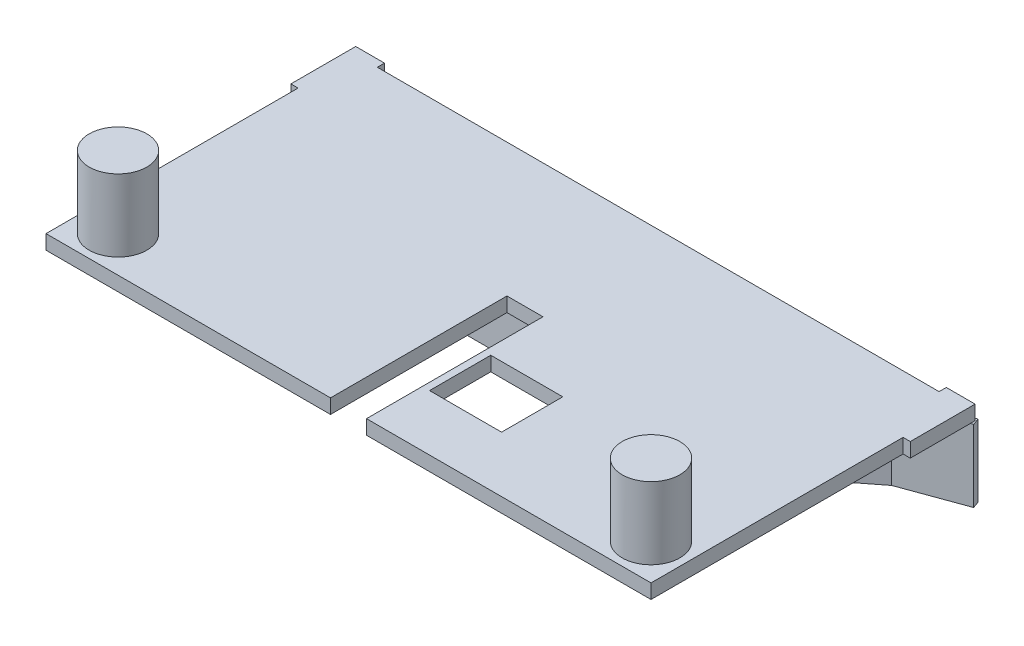
ISO-10303-21;
HEADER;
FILE_DESCRIPTION(('STEP AP214'),'2;1');
FILE_NAME('part.step','',(''),(''),'','','');
FILE_SCHEMA(('AUTOMOTIVE_DESIGN { 1 0 10303 214 1 1 1 1 }'));
ENDSEC;
DATA;
#1=APPLICATION_CONTEXT('core data for automotive mechanical design processes');
#2=APPLICATION_PROTOCOL_DEFINITION('international standard','automotive_design',2000,#1);
#3=PRODUCT_CONTEXT('',#1,'mechanical');
#4=PRODUCT('Part','Part','',(#3));
#5=PRODUCT_RELATED_PRODUCT_CATEGORY('part','',(#4));
#6=PRODUCT_DEFINITION_FORMATION('','',#4);
#7=PRODUCT_DEFINITION_CONTEXT('part definition',#1,'design');
#8=PRODUCT_DEFINITION('design','',#6,#7);
#9=PRODUCT_DEFINITION_SHAPE('','',#8);
#10=(LENGTH_UNIT() NAMED_UNIT(*) SI_UNIT(.MILLI.,.METRE.));
#11=(NAMED_UNIT(*) PLANE_ANGLE_UNIT() SI_UNIT($,.RADIAN.));
#12=(NAMED_UNIT(*) SI_UNIT($,.STERADIAN.) SOLID_ANGLE_UNIT());
#13=UNCERTAINTY_MEASURE_WITH_UNIT(LENGTH_MEASURE(1.E-05),#10,'distance_accuracy_value','');
#14=(GEOMETRIC_REPRESENTATION_CONTEXT(3) GLOBAL_UNCERTAINTY_ASSIGNED_CONTEXT((#13)) GLOBAL_UNIT_ASSIGNED_CONTEXT((#10,
#11,#12)) REPRESENTATION_CONTEXT('',''));
#15=CARTESIAN_POINT('',(0.,0.,0.));
#16=DIRECTION('',(0.,0.,1.));
#17=DIRECTION('',(1.,0.,0.));
#18=AXIS2_PLACEMENT_3D('',#15,#16,#17);
#19=CARTESIAN_POINT('',(0.,-6.35,0.));
#20=DIRECTION('',(0.,-1.,0.));
#21=DIRECTION('',(0.,0.,-1.));
#22=AXIS2_PLACEMENT_3D('',#19,#20,#21);
#23=PLANE('',#22);
#24=DIRECTION('',(0.93969262078591,0.,-0.342020143325663));
#25=VECTOR('',#24,1.);
#26=CARTESIAN_POINT('',(273.05,-6.35,-142.24));
#27=LINE('',#26,#25);
#28=CARTESIAN_POINT('',(219.136547038803,-6.35,-122.617107895613));
#29=VERTEX_POINT('',#28);
#30=CARTESIAN_POINT('',(266.071407354586,-6.35,-139.7));
#31=VERTEX_POINT('',#30);
#32=EDGE_CURVE('E50',#29,#31,#27,.T.);
#33=ORIENTED_EDGE('',*,*,#32,.F.);
#34=DIRECTION('',(0.788707331575262,0.,-0.614768855033686));
#35=VECTOR('',#34,1.);
#36=CARTESIAN_POINT('',(127.,-6.35,-50.8));
#37=LINE('',#36,#35);
#38=CARTESIAN_POINT('',(127.,-6.35,-50.8));
#39=VERTEX_POINT('',#38);
#40=EDGE_CURVE('E54',#39,#29,#37,.T.);
#41=ORIENTED_EDGE('',*,*,#40,.F.);
#42=DIRECTION('',(1.,0.,0.));
#43=VECTOR('',#42,1.);
#44=CARTESIAN_POINT('',(-127.,-6.35,-50.8));
#45=LINE('',#44,#43);
#46=CARTESIAN_POINT('',(-127.,-6.35,-50.8));
#47=VERTEX_POINT('',#46);
#48=EDGE_CURVE('E460',#47,#39,#45,.T.);
#49=ORIENTED_EDGE('',*,*,#48,.F.);
#50=DIRECTION('',(0.788707331575262,0.,0.614768855033686));
#51=VECTOR('',#50,1.);
#52=CARTESIAN_POINT('',(-219.136547038803,-6.35,-122.617107895613));
#53=LINE('',#52,#51);
#54=CARTESIAN_POINT('',(-219.136547038803,-6.35,-122.617107895613));
#55=VERTEX_POINT('',#54);
#56=EDGE_CURVE('E455',#55,#47,#53,.T.);
#57=ORIENTED_EDGE('',*,*,#56,.F.);
#58=DIRECTION('',(0.93969262078591,0.,0.342020143325663));
#59=VECTOR('',#58,1.);
#60=CARTESIAN_POINT('',(-273.05,-6.35,-142.24));
#61=LINE('',#60,#59);
#62=CARTESIAN_POINT('',(-266.071407354585,-6.35,-139.7));
#63=VERTEX_POINT('',#62);
#64=EDGE_CURVE('E441',#63,#55,#61,.T.);
#65=ORIENTED_EDGE('',*,*,#64,.F.);
#66=DIRECTION('',(-1.,0.,0.));
#67=VECTOR('',#66,1.);
#68=CARTESIAN_POINT('',(-273.05,-6.35,-139.7));
#69=LINE('',#68,#67);
#70=CARTESIAN_POINT('',(-247.649999999999,-6.35,-139.7));
#71=VERTEX_POINT('',#70);
#72=EDGE_CURVE('E430',#71,#63,#69,.T.);
#73=ORIENTED_EDGE('',*,*,#72,.F.);
#74=DIRECTION('',(0.,0.,1.));
#75=VECTOR('',#74,1.);
#76=CARTESIAN_POINT('',(-247.649999999999,-6.35,-133.35));
#77=LINE('',#76,#75);
#78=CARTESIAN_POINT('',(-247.649999999999,-6.35,-133.35));
#79=VERTEX_POINT('',#78);
#80=EDGE_CURVE('E292',#71,#79,#77,.T.);
#81=ORIENTED_EDGE('',*,*,#80,.T.);
#82=DIRECTION('',(1.,0.,0.));
#83=VECTOR('',#82,1.);
#84=CARTESIAN_POINT('',(-247.649999999999,-6.35,-133.35));
#85=LINE('',#84,#83);
#86=CARTESIAN_POINT('',(247.650000000001,-6.35,-133.35));
#87=VERTEX_POINT('',#86);
#88=EDGE_CURVE('E296',#79,#87,#85,.T.);
#89=ORIENTED_EDGE('',*,*,#88,.T.);
#90=DIRECTION('',(0.,0.,-1.));
#91=VECTOR('',#90,1.);
#92=CARTESIAN_POINT('',(247.650000000001,-6.35,-133.35));
#93=LINE('',#92,#91);
#94=CARTESIAN_POINT('',(247.650000000001,-6.35,-139.7));
#95=VERTEX_POINT('',#94);
#96=EDGE_CURVE('E289',#87,#95,#93,.T.);
#97=ORIENTED_EDGE('',*,*,#96,.T.);
#98=EDGE_CURVE('E429',#31,#95,#69,.T.);
#99=ORIENTED_EDGE('',*,*,#98,.F.);
#100=EDGE_LOOP('',(#33,#41,#49,#57,#65,#73,#81,#89,#97,#99));
#101=FACE_BOUND('',#100,.T.);
#102=ADVANCED_FACE('F35',(#101),#23,.T.);
#103=CARTESIAN_POINT('',(-273.05,6.35,-139.7));
#104=DIRECTION('',(0.,0.,1.));
#105=DIRECTION('',(1.,0.,0.));
#106=AXIS2_PLACEMENT_3D('',#103,#104,#105);
#107=PLANE('',#106);
#108=CARTESIAN_POINT('',(273.05,-6.35,-139.7));
#109=VERTEX_POINT('',#108);
#110=EDGE_CURVE('E425',#109,#31,#69,.T.);
#111=ORIENTED_EDGE('',*,*,#110,.T.);
#112=ORIENTED_EDGE('',*,*,#98,.T.);
#113=DIRECTION('',(0.,1.,0.));
#114=VECTOR('',#113,1.);
#115=CARTESIAN_POINT('',(247.650000000001,-6.35,-139.7));
#116=LINE('',#115,#114);
#117=CARTESIAN_POINT('',(247.650000000001,6.35,-139.7));
#118=VERTEX_POINT('',#117);
#119=EDGE_CURVE('E299',#95,#118,#116,.T.);
#120=ORIENTED_EDGE('',*,*,#119,.T.);
#121=DIRECTION('',(-1.,0.,0.));
#122=VECTOR('',#121,1.);
#123=CARTESIAN_POINT('',(-273.05,6.35,-139.7));
#124=LINE('',#123,#122);
#125=CARTESIAN_POINT('',(273.05,6.35,-139.7));
#126=VERTEX_POINT('',#125);
#127=EDGE_CURVE('E411',#126,#118,#124,.T.);
#128=ORIENTED_EDGE('',*,*,#127,.F.);
#129=DIRECTION('',(0.,-1.,0.));
#130=VECTOR('',#129,1.);
#131=CARTESIAN_POINT('',(273.05,6.35,-139.7));
#132=LINE('',#131,#130);
#133=EDGE_CURVE('E438',#126,#109,#132,.T.);
#134=ORIENTED_EDGE('',*,*,#133,.T.);
#135=EDGE_LOOP('',(#111,#112,#120,#128,#134));
#136=FACE_BOUND('',#135,.T.);
#137=ADVANCED_FACE('F551',(#136),#107,.F.);
#138=CARTESIAN_POINT('',(-273.05,6.35,139.7));
#139=DIRECTION('',(0.,0.,-1.));
#140=DIRECTION('',(-1.,0.,0.));
#141=AXIS2_PLACEMENT_3D('',#138,#139,#140);
#142=PLANE('',#141);
#143=DIRECTION('',(1.,0.,0.));
#144=VECTOR('',#143,1.);
#145=CARTESIAN_POINT('',(-273.05,-6.35,139.7));
#146=LINE('',#145,#144);
#147=CARTESIAN_POINT('',(15.875,-6.35,139.7));
#148=VERTEX_POINT('',#147);
#149=CARTESIAN_POINT('',(266.7,-6.35,139.7));
#150=VERTEX_POINT('',#149);
#151=EDGE_CURVE('E434',#148,#150,#146,.T.);
#152=ORIENTED_EDGE('',*,*,#151,.T.);
#153=DIRECTION('',(0.,1.,0.));
#154=VECTOR('',#153,1.);
#155=CARTESIAN_POINT('',(266.7,-6.35,139.7));
#156=LINE('',#155,#154);
#157=CARTESIAN_POINT('',(266.7,6.35,139.7));
#158=VERTEX_POINT('',#157);
#159=EDGE_CURVE('E303',#150,#158,#156,.T.);
#160=ORIENTED_EDGE('',*,*,#159,.T.);
#161=DIRECTION('',(1.,0.,0.));
#162=VECTOR('',#161,1.);
#163=CARTESIAN_POINT('',(-273.05,6.35,139.7));
#164=LINE('',#163,#162);
#165=CARTESIAN_POINT('',(15.875,6.35,139.7));
#166=VERTEX_POINT('',#165);
#167=EDGE_CURVE('E417',#166,#158,#164,.T.);
#168=ORIENTED_EDGE('',*,*,#167,.F.);
#169=DIRECTION('',(0.,1.,0.));
#170=VECTOR('',#169,1.);
#171=CARTESIAN_POINT('',(15.875,-6.35,139.7));
#172=LINE('',#171,#170);
#173=EDGE_CURVE('E398',#148,#166,#172,.T.);
#174=ORIENTED_EDGE('',*,*,#173,.F.);
#175=EDGE_LOOP('',(#152,#160,#168,#174));
#176=FACE_BOUND('',#175,.T.);
#177=ADVANCED_FACE('F533',(#176),#142,.F.);
#178=CARTESIAN_POINT('',(273.05,6.35,139.7));
#179=DIRECTION('',(-1.,0.,0.));
#180=DIRECTION('',(0.,0.,1.));
#181=AXIS2_PLACEMENT_3D('',#178,#179,#180);
#182=PLANE('',#181);
#183=DIRECTION('',(0.,0.,-1.));
#184=VECTOR('',#183,1.);
#185=CARTESIAN_POINT('',(273.05,6.35,139.7));
#186=LINE('',#185,#184);
#187=CARTESIAN_POINT('',(273.05,6.35,-82.55));
#188=VERTEX_POINT('',#187);
#189=EDGE_CURVE('E407',#188,#126,#186,.T.);
#190=ORIENTED_EDGE('',*,*,#189,.F.);
#191=DIRECTION('',(0.,1.,0.));
#192=VECTOR('',#191,1.);
#193=CARTESIAN_POINT('',(273.05,-6.35,-82.55));
#194=LINE('',#193,#192);
#195=CARTESIAN_POINT('',(273.05,-6.35,-82.55));
#196=VERTEX_POINT('',#195);
#197=EDGE_CURVE('E322',#196,#188,#194,.T.);
#198=ORIENTED_EDGE('',*,*,#197,.F.);
#199=DIRECTION('',(0.,0.,-1.));
#200=VECTOR('',#199,1.);
#201=CARTESIAN_POINT('',(273.05,-6.35,139.7));
#202=LINE('',#201,#200);
#203=CARTESIAN_POINT('',(273.05,-6.35,-135.482471144778));
#204=VERTEX_POINT('',#203);
#205=EDGE_CURVE('E421',#196,#204,#202,.T.);
#206=ORIENTED_EDGE('',*,*,#205,.T.);
#207=EDGE_CURVE('E400',#204,#109,#202,.T.);
#208=ORIENTED_EDGE('',*,*,#207,.T.);
#209=ORIENTED_EDGE('',*,*,#133,.F.);
#210=EDGE_LOOP('',(#190,#198,#206,#208,#209));
#211=FACE_BOUND('',#210,.T.);
#212=ADVANCED_FACE('F37',(#211),#182,.F.);
#213=CARTESIAN_POINT('',(-247.649999999999,6.35,-139.7));
#214=VERTEX_POINT('',#213);
#215=CARTESIAN_POINT('',(-273.05,6.35,-139.7));
#216=VERTEX_POINT('',#215);
#217=EDGE_CURVE('E409',#214,#216,#124,.T.);
#218=ORIENTED_EDGE('',*,*,#217,.F.);
#219=DIRECTION('',(0.,1.,0.));
#220=VECTOR('',#219,1.);
#221=CARTESIAN_POINT('',(-247.649999999999,-6.35,-139.7));
#222=LINE('',#221,#220);
#223=EDGE_CURVE('E313',#71,#214,#222,.T.);
#224=ORIENTED_EDGE('',*,*,#223,.F.);
#225=ORIENTED_EDGE('',*,*,#72,.T.);
#226=CARTESIAN_POINT('',(-273.05,-6.35,-139.7));
#227=VERTEX_POINT('',#226);
#228=EDGE_CURVE('E424',#63,#227,#69,.T.);
#229=ORIENTED_EDGE('',*,*,#228,.T.);
#230=DIRECTION('',(0.,-1.,0.));
#231=VECTOR('',#230,1.);
#232=CARTESIAN_POINT('',(-273.05,6.35,-139.7));
#233=LINE('',#232,#231);
#234=EDGE_CURVE('E420',#216,#227,#233,.T.);
#235=ORIENTED_EDGE('',*,*,#234,.F.);
#236=EDGE_LOOP('',(#218,#224,#225,#229,#235));
#237=FACE_BOUND('',#236,.T.);
#238=ADVANCED_FACE('F569',(#237),#107,.F.);
#239=CARTESIAN_POINT('',(-273.05,6.35,139.7));
#240=DIRECTION('',(1.,0.,0.));
#241=DIRECTION('',(0.,0.,-1.));
#242=AXIS2_PLACEMENT_3D('',#239,#240,#241);
#243=PLANE('',#242);
#244=DIRECTION('',(0.,0.,1.));
#245=VECTOR('',#244,1.);
#246=CARTESIAN_POINT('',(-273.05,-6.35,139.7));
#247=LINE('',#246,#245);
#248=CARTESIAN_POINT('',(-273.05,-6.35,-135.482471144778));
#249=VERTEX_POINT('',#248);
#250=EDGE_CURVE('E431',#227,#249,#247,.T.);
#251=ORIENTED_EDGE('',*,*,#250,.T.);
#252=CARTESIAN_POINT('',(-273.05,-6.35,-82.55));
#253=VERTEX_POINT('',#252);
#254=EDGE_CURVE('E428',#249,#253,#247,.T.);
#255=ORIENTED_EDGE('',*,*,#254,.T.);
#256=DIRECTION('',(0.,1.,0.));
#257=VECTOR('',#256,1.);
#258=CARTESIAN_POINT('',(-273.05,-6.35,-82.55));
#259=LINE('',#258,#257);
#260=CARTESIAN_POINT('',(-273.05,6.35,-82.55));
#261=VERTEX_POINT('',#260);
#262=EDGE_CURVE('E343',#253,#261,#259,.T.);
#263=ORIENTED_EDGE('',*,*,#262,.T.);
#264=DIRECTION('',(0.,0.,1.));
#265=VECTOR('',#264,1.);
#266=CARTESIAN_POINT('',(-273.05,6.35,139.7));
#267=LINE('',#266,#265);
#268=EDGE_CURVE('E414',#216,#261,#267,.T.);
#269=ORIENTED_EDGE('',*,*,#268,.F.);
#270=ORIENTED_EDGE('',*,*,#234,.T.);
#271=EDGE_LOOP('',(#251,#255,#263,#269,#270));
#272=FACE_BOUND('',#271,.T.);
#273=ADVANCED_FACE('F575',(#272),#243,.F.);
#274=CARTESIAN_POINT('',(-266.7,6.35,139.7));
#275=VERTEX_POINT('',#274);
#276=CARTESIAN_POINT('',(-15.875,6.35,139.7));
#277=VERTEX_POINT('',#276);
#278=EDGE_CURVE('E418',#275,#277,#164,.T.);
#279=ORIENTED_EDGE('',*,*,#278,.F.);
#280=DIRECTION('',(0.,1.,0.));
#281=VECTOR('',#280,1.);
#282=CARTESIAN_POINT('',(-266.7,-6.35,139.7));
#283=LINE('',#282,#281);
#284=CARTESIAN_POINT('',(-266.7,-6.35,139.7));
#285=VERTEX_POINT('',#284);
#286=EDGE_CURVE('E337',#285,#275,#283,.T.);
#287=ORIENTED_EDGE('',*,*,#286,.F.);
#288=CARTESIAN_POINT('',(-15.875,-6.35,139.7));
#289=VERTEX_POINT('',#288);
#290=EDGE_CURVE('E410',#285,#289,#146,.T.);
#291=ORIENTED_EDGE('',*,*,#290,.T.);
#292=DIRECTION('',(0.,1.,0.));
#293=VECTOR('',#292,1.);
#294=CARTESIAN_POINT('',(-15.875,-6.35,139.7));
#295=LINE('',#294,#293);
#296=EDGE_CURVE('E401',#289,#277,#295,.T.);
#297=ORIENTED_EDGE('',*,*,#296,.T.);
#298=EDGE_LOOP('',(#279,#287,#291,#297));
#299=FACE_BOUND('',#298,.T.);
#300=ADVANCED_FACE('F517',(#299),#142,.F.);
#301=CARTESIAN_POINT('',(0.,6.35,0.));
#302=DIRECTION('',(0.,-1.,0.));
#303=DIRECTION('',(0.,0.,-1.));
#304=AXIS2_PLACEMENT_3D('',#301,#302,#303);
#305=PLANE('',#304);
#306=CARTESIAN_POINT('',(-234.95,6.34999999999999,107.95));
#307=DIRECTION('',(0.,-1.,0.));
#308=DIRECTION('',(0.,0.,-1.));
#309=AXIS2_PLACEMENT_3D('',#306,#307,#308);
#310=CIRCLE('',#309,25.4);
#311=CARTESIAN_POINT('',(-234.95,6.34999999999999,82.55));
#312=VERTEX_POINT('',#311);
#313=EDGE_CURVE('E11',#312,#312,#310,.F.);
#314=ORIENTED_EDGE('',*,*,#313,.F.);
#315=EDGE_LOOP('',(#314));
#316=FACE_BOUND('',#315,.T.);
#317=CARTESIAN_POINT('',(234.95,6.34999999999999,107.95));
#318=DIRECTION('',(0.,-1.,0.));
#319=DIRECTION('',(0.,0.,-1.));
#320=AXIS2_PLACEMENT_3D('',#317,#318,#319);
#321=CIRCLE('',#320,25.4);
#322=CARTESIAN_POINT('',(234.95,6.34999999999999,82.55));
#323=VERTEX_POINT('',#322);
#324=EDGE_CURVE('E43',#323,#323,#321,.F.);
#325=ORIENTED_EDGE('',*,*,#324,.F.);
#326=EDGE_LOOP('',(#325));
#327=FACE_BOUND('',#326,.T.);
#328=DIRECTION('',(-1.,0.,0.));
#329=VECTOR('',#328,1.);
#330=CARTESIAN_POINT('',(22.225,6.35,36.5125));
#331=LINE('',#330,#329);
#332=CARTESIAN_POINT('',(85.725,6.35,36.5125));
#333=VERTEX_POINT('',#332);
#334=CARTESIAN_POINT('',(22.225,6.35,36.5125));
#335=VERTEX_POINT('',#334);
#336=EDGE_CURVE('E365',#333,#335,#331,.T.);
#337=ORIENTED_EDGE('',*,*,#336,.F.);
#338=DIRECTION('',(0.,0.,-1.));
#339=VECTOR('',#338,1.);
#340=CARTESIAN_POINT('',(85.725,6.35,90.4875));
#341=LINE('',#340,#339);
#342=CARTESIAN_POINT('',(85.725,6.35,90.4875));
#343=VERTEX_POINT('',#342);
#344=EDGE_CURVE('E310',#343,#333,#341,.T.);
#345=ORIENTED_EDGE('',*,*,#344,.F.);
#346=DIRECTION('',(1.,0.,0.));
#347=VECTOR('',#346,1.);
#348=CARTESIAN_POINT('',(22.225,6.35,90.4875));
#349=LINE('',#348,#347);
#350=CARTESIAN_POINT('',(22.225,6.35,90.4875));
#351=VERTEX_POINT('',#350);
#352=EDGE_CURVE('E354',#351,#343,#349,.T.);
#353=ORIENTED_EDGE('',*,*,#352,.F.);
#354=DIRECTION('',(0.,0.,1.));
#355=VECTOR('',#354,1.);
#356=CARTESIAN_POINT('',(22.225,6.35,90.4875));
#357=LINE('',#356,#355);
#358=EDGE_CURVE('E368',#335,#351,#357,.T.);
#359=ORIENTED_EDGE('',*,*,#358,.F.);
#360=EDGE_LOOP('',(#337,#345,#353,#359));
#361=FACE_BOUND('',#360,.T.);
#362=ORIENTED_EDGE('',*,*,#167,.T.);
#363=DIRECTION('',(0.,0.,1.));
#364=VECTOR('',#363,1.);
#365=CARTESIAN_POINT('',(266.7,6.35,139.7));
#366=LINE('',#365,#364);
#367=CARTESIAN_POINT('',(266.7,6.35,-82.55));
#368=VERTEX_POINT('',#367);
#369=EDGE_CURVE('E283',#368,#158,#366,.T.);
#370=ORIENTED_EDGE('',*,*,#369,.F.);
#371=DIRECTION('',(-1.,0.,0.));
#372=VECTOR('',#371,1.);
#373=CARTESIAN_POINT('',(266.7,6.35,-82.55));
#374=LINE('',#373,#372);
#375=EDGE_CURVE('E280',#188,#368,#374,.T.);
#376=ORIENTED_EDGE('',*,*,#375,.F.);
#377=ORIENTED_EDGE('',*,*,#189,.T.);
#378=ORIENTED_EDGE('',*,*,#127,.T.);
#379=DIRECTION('',(0.,0.,-1.));
#380=VECTOR('',#379,1.);
#381=CARTESIAN_POINT('',(247.650000000001,6.35,-133.35));
#382=LINE('',#381,#380);
#383=CARTESIAN_POINT('',(247.650000000001,6.35,-133.35));
#384=VERTEX_POINT('',#383);
#385=EDGE_CURVE('E300',#384,#118,#382,.T.);
#386=ORIENTED_EDGE('',*,*,#385,.F.);
#387=DIRECTION('',(1.,0.,0.));
#388=VECTOR('',#387,1.);
#389=CARTESIAN_POINT('',(-247.649999999999,6.35,-133.35));
#390=LINE('',#389,#388);
#391=CARTESIAN_POINT('',(-247.649999999999,6.35,-133.35));
#392=VERTEX_POINT('',#391);
#393=EDGE_CURVE('E293',#392,#384,#390,.T.);
#394=ORIENTED_EDGE('',*,*,#393,.F.);
#395=DIRECTION('',(0.,0.,1.));
#396=VECTOR('',#395,1.);
#397=CARTESIAN_POINT('',(-247.649999999999,6.35,-133.35));
#398=LINE('',#397,#396);
#399=EDGE_CURVE('E302',#214,#392,#398,.T.);
#400=ORIENTED_EDGE('',*,*,#399,.F.);
#401=ORIENTED_EDGE('',*,*,#217,.T.);
#402=ORIENTED_EDGE('',*,*,#268,.T.);
#403=DIRECTION('',(-1.,0.,0.));
#404=VECTOR('',#403,1.);
#405=CARTESIAN_POINT('',(-266.7,6.35,-82.55));
#406=LINE('',#405,#404);
#407=CARTESIAN_POINT('',(-266.7,6.35,-82.55));
#408=VERTEX_POINT('',#407);
#409=EDGE_CURVE('E334',#408,#261,#406,.T.);
#410=ORIENTED_EDGE('',*,*,#409,.F.);
#411=DIRECTION('',(0.,0.,-1.));
#412=VECTOR('',#411,1.);
#413=CARTESIAN_POINT('',(-266.7,6.35,139.7));
#414=LINE('',#413,#412);
#415=EDGE_CURVE('E338',#275,#408,#414,.T.);
#416=ORIENTED_EDGE('',*,*,#415,.F.);
#417=ORIENTED_EDGE('',*,*,#278,.T.);
#418=DIRECTION('',(0.,0.,1.));
#419=VECTOR('',#418,1.);
#420=CARTESIAN_POINT('',(-15.875,6.35,-15.875));
#421=LINE('',#420,#419);
#422=CARTESIAN_POINT('',(-15.875,6.35,-15.875));
#423=VERTEX_POINT('',#422);
#424=EDGE_CURVE('E384',#423,#277,#421,.T.);
#425=ORIENTED_EDGE('',*,*,#424,.F.);
#426=DIRECTION('',(-1.,0.,0.));
#427=VECTOR('',#426,1.);
#428=CARTESIAN_POINT('',(-15.875,6.35,-15.875));
#429=LINE('',#428,#427);
#430=CARTESIAN_POINT('',(15.875,6.35,-15.875));
#431=VERTEX_POINT('',#430);
#432=EDGE_CURVE('E393',#431,#423,#429,.T.);
#433=ORIENTED_EDGE('',*,*,#432,.F.);
#434=DIRECTION('',(0.,0.,-1.));
#435=VECTOR('',#434,1.);
#436=CARTESIAN_POINT('',(15.875,6.35,-15.875));
#437=LINE('',#436,#435);
#438=EDGE_CURVE('E346',#166,#431,#437,.T.);
#439=ORIENTED_EDGE('',*,*,#438,.F.);
#440=EDGE_LOOP('',(#362,#370,#376,#377,#378,#386,#394,#400,#401,#402,#410,#416,#417,#425,#433,#439));
#441=FACE_BOUND('',#440,.T.);
#442=ADVANCED_FACE('F513',(#316,#327,#361,#441),#305,.F.);
#443=DIRECTION('',(-0.93969262078591,0.,0.342020143325663));
#444=VECTOR('',#443,1.);
#445=CARTESIAN_POINT('',(222.25,-6.35,-116.992783244055));
#446=LINE('',#445,#444);
#447=CARTESIAN_POINT('',(222.25,-6.35,-116.992783244055));
#448=VERTEX_POINT('',#447);
#449=EDGE_CURVE('E279',#204,#448,#446,.T.);
#450=ORIENTED_EDGE('',*,*,#449,.F.);
#451=ORIENTED_EDGE('',*,*,#205,.F.);
#452=DIRECTION('',(-1.,0.,0.));
#453=VECTOR('',#452,1.);
#454=CARTESIAN_POINT('',(266.7,-6.35,-82.55));
#455=LINE('',#454,#453);
#456=CARTESIAN_POINT('',(266.7,-6.35,-82.55));
#457=VERTEX_POINT('',#456);
#458=EDGE_CURVE('E317',#196,#457,#455,.T.);
#459=ORIENTED_EDGE('',*,*,#458,.T.);
#460=DIRECTION('',(0.,0.,1.));
#461=VECTOR('',#460,1.);
#462=CARTESIAN_POINT('',(266.7,-6.35,139.7));
#463=LINE('',#462,#461);
#464=EDGE_CURVE('E320',#457,#150,#463,.T.);
#465=ORIENTED_EDGE('',*,*,#464,.T.);
#466=ORIENTED_EDGE('',*,*,#151,.F.);
#467=DIRECTION('',(0.,0.,-1.));
#468=VECTOR('',#467,1.);
#469=CARTESIAN_POINT('',(15.875,-6.35,-15.875));
#470=LINE('',#469,#468);
#471=CARTESIAN_POINT('',(15.875,-6.35,-15.875));
#472=VERTEX_POINT('',#471);
#473=EDGE_CURVE('E380',#148,#472,#470,.T.);
#474=ORIENTED_EDGE('',*,*,#473,.T.);
#475=DIRECTION('',(-1.,0.,0.));
#476=VECTOR('',#475,1.);
#477=CARTESIAN_POINT('',(-15.875,-6.35,-15.875));
#478=LINE('',#477,#476);
#479=CARTESIAN_POINT('',(-15.875,-6.35,-15.875));
#480=VERTEX_POINT('',#479);
#481=EDGE_CURVE('E383',#472,#480,#478,.T.);
#482=ORIENTED_EDGE('',*,*,#481,.T.);
#483=DIRECTION('',(0.,0.,1.));
#484=VECTOR('',#483,1.);
#485=CARTESIAN_POINT('',(-15.875,-6.35,-15.875));
#486=LINE('',#485,#484);
#487=EDGE_CURVE('E387',#480,#289,#486,.T.);
#488=ORIENTED_EDGE('',*,*,#487,.T.);
#489=ORIENTED_EDGE('',*,*,#290,.F.);
#490=DIRECTION('',(0.,0.,-1.));
#491=VECTOR('',#490,1.);
#492=CARTESIAN_POINT('',(-266.7,-6.35,139.7));
#493=LINE('',#492,#491);
#494=CARTESIAN_POINT('',(-266.7,-6.35,-82.55));
#495=VERTEX_POINT('',#494);
#496=EDGE_CURVE('E330',#285,#495,#493,.T.);
#497=ORIENTED_EDGE('',*,*,#496,.T.);
#498=DIRECTION('',(-1.,0.,0.));
#499=VECTOR('',#498,1.);
#500=CARTESIAN_POINT('',(-266.7,-6.35,-82.55));
#501=LINE('',#500,#499);
#502=EDGE_CURVE('E333',#495,#253,#501,.T.);
#503=ORIENTED_EDGE('',*,*,#502,.T.);
#504=ORIENTED_EDGE('',*,*,#254,.F.);
#505=DIRECTION('',(-0.93969262078591,0.,-0.342020143325663));
#506=VECTOR('',#505,1.);
#507=CARTESIAN_POINT('',(-222.25,-6.35,-116.992783244055));
#508=LINE('',#507,#506);
#509=CARTESIAN_POINT('',(-222.25,-6.35,-116.992783244055));
#510=VERTEX_POINT('',#509);
#511=EDGE_CURVE('E461',#510,#249,#508,.T.);
#512=ORIENTED_EDGE('',*,*,#511,.F.);
#513=DIRECTION('',(-0.788707331575263,0.,-0.614768855033685));
#514=VECTOR('',#513,1.);
#515=CARTESIAN_POINT('',(-129.182460014868,-6.35,-44.45));
#516=LINE('',#515,#514);
#517=CARTESIAN_POINT('',(-129.182460014868,-6.35,-44.45));
#518=VERTEX_POINT('',#517);
#519=EDGE_CURVE('E470',#518,#510,#516,.T.);
#520=ORIENTED_EDGE('',*,*,#519,.F.);
#521=DIRECTION('',(-1.,0.,0.));
#522=VECTOR('',#521,1.);
#523=CARTESIAN_POINT('',(129.182460014868,-6.35,-44.45));
#524=LINE('',#523,#522);
#525=CARTESIAN_POINT('',(129.182460014868,-6.35,-44.45));
#526=VERTEX_POINT('',#525);
#527=EDGE_CURVE('E473',#526,#518,#524,.T.);
#528=ORIENTED_EDGE('',*,*,#527,.F.);
#529=DIRECTION('',(-0.788707331575263,0.,0.614768855033686));
#530=VECTOR('',#529,1.);
#531=CARTESIAN_POINT('',(222.25,-6.35,-116.992783244055));
#532=LINE('',#531,#530);
#533=EDGE_CURVE('E476',#448,#526,#532,.T.);
#534=ORIENTED_EDGE('',*,*,#533,.F.);
#535=EDGE_LOOP('',(#450,#451,#459,#465,#466,#474,#482,#488,#489,#497,#503,#504,#512,#520,#528,#534));
#536=FACE_BOUND('',#535,.T.);
#537=DIRECTION('',(0.,0.,-1.));
#538=VECTOR('',#537,1.);
#539=CARTESIAN_POINT('',(85.725,-6.35,90.4875));
#540=LINE('',#539,#538);
#541=CARTESIAN_POINT('',(85.725,-6.35,90.4875));
#542=VERTEX_POINT('',#541);
#543=CARTESIAN_POINT('',(85.725,-6.35,36.5125));
#544=VERTEX_POINT('',#543);
#545=EDGE_CURVE('E350',#542,#544,#540,.T.);
#546=ORIENTED_EDGE('',*,*,#545,.T.);
#547=DIRECTION('',(-1.,0.,0.));
#548=VECTOR('',#547,1.);
#549=CARTESIAN_POINT('',(22.225,-6.35,36.5125));
#550=LINE('',#549,#548);
#551=CARTESIAN_POINT('',(22.225,-6.35,36.5125));
#552=VERTEX_POINT('',#551);
#553=EDGE_CURVE('E353',#544,#552,#550,.T.);
#554=ORIENTED_EDGE('',*,*,#553,.T.);
#555=DIRECTION('',(0.,0.,1.));
#556=VECTOR('',#555,1.);
#557=CARTESIAN_POINT('',(22.225,-6.35,90.4875));
#558=LINE('',#557,#556);
#559=CARTESIAN_POINT('',(22.225,-6.35,90.4875));
#560=VERTEX_POINT('',#559);
#561=EDGE_CURVE('E357',#552,#560,#558,.T.);
#562=ORIENTED_EDGE('',*,*,#561,.T.);
#563=DIRECTION('',(1.,0.,0.));
#564=VECTOR('',#563,1.);
#565=CARTESIAN_POINT('',(22.225,-6.35,90.4875));
#566=LINE('',#565,#564);
#567=EDGE_CURVE('E360',#560,#542,#566,.T.);
#568=ORIENTED_EDGE('',*,*,#567,.T.);
#569=EDGE_LOOP('',(#546,#554,#562,#568));
#570=FACE_BOUND('',#569,.T.);
#571=ADVANCED_FACE('F516',(#536,#570),#23,.T.);
#572=CARTESIAN_POINT('',(15.875,-6.35,-15.875));
#573=DIRECTION('',(1.,0.,0.));
#574=DIRECTION('',(0.,0.,-1.));
#575=AXIS2_PLACEMENT_3D('',#572,#573,#574);
#576=PLANE('',#575);
#577=ORIENTED_EDGE('',*,*,#438,.T.);
#578=DIRECTION('',(0.,1.,0.));
#579=VECTOR('',#578,1.);
#580=CARTESIAN_POINT('',(15.875,-6.35,-15.875));
#581=LINE('',#580,#579);
#582=EDGE_CURVE('E390',#472,#431,#581,.T.);
#583=ORIENTED_EDGE('',*,*,#582,.F.);
#584=ORIENTED_EDGE('',*,*,#473,.F.);
#585=ORIENTED_EDGE('',*,*,#173,.T.);
#586=EDGE_LOOP('',(#577,#583,#584,#585));
#587=FACE_BOUND('',#586,.T.);
#588=ADVANCED_FACE('F597',(#587),#576,.F.);
#589=CARTESIAN_POINT('',(-15.875,-6.35,-15.875));
#590=DIRECTION('',(-1.,0.,0.));
#591=DIRECTION('',(0.,0.,1.));
#592=AXIS2_PLACEMENT_3D('',#589,#590,#591);
#593=PLANE('',#592);
#594=ORIENTED_EDGE('',*,*,#424,.T.);
#595=ORIENTED_EDGE('',*,*,#296,.F.);
#596=ORIENTED_EDGE('',*,*,#487,.F.);
#597=DIRECTION('',(0.,1.,0.));
#598=VECTOR('',#597,1.);
#599=CARTESIAN_POINT('',(-15.875,-6.35,-15.875));
#600=LINE('',#599,#598);
#601=EDGE_CURVE('E404',#480,#423,#600,.T.);
#602=ORIENTED_EDGE('',*,*,#601,.T.);
#603=EDGE_LOOP('',(#594,#595,#596,#602));
#604=FACE_BOUND('',#603,.T.);
#605=ADVANCED_FACE('F592',(#604),#593,.F.);
#606=CARTESIAN_POINT('',(-15.875,-6.35,-15.875));
#607=DIRECTION('',(0.,0.,-1.));
#608=DIRECTION('',(-1.,0.,0.));
#609=AXIS2_PLACEMENT_3D('',#606,#607,#608);
#610=PLANE('',#609);
#611=ORIENTED_EDGE('',*,*,#432,.T.);
#612=ORIENTED_EDGE('',*,*,#601,.F.);
#613=ORIENTED_EDGE('',*,*,#481,.F.);
#614=ORIENTED_EDGE('',*,*,#582,.T.);
#615=EDGE_LOOP('',(#611,#612,#613,#614));
#616=FACE_BOUND('',#615,.T.);
#617=ADVANCED_FACE('F594',(#616),#610,.F.);
#618=CARTESIAN_POINT('',(-266.7,-6.35,-82.55));
#619=DIRECTION('',(0.,0.,-1.));
#620=DIRECTION('',(-1.,0.,0.));
#621=AXIS2_PLACEMENT_3D('',#618,#619,#620);
#622=PLANE('',#621);
#623=ORIENTED_EDGE('',*,*,#409,.T.);
#624=ORIENTED_EDGE('',*,*,#262,.F.);
#625=ORIENTED_EDGE('',*,*,#502,.F.);
#626=DIRECTION('',(0.,1.,0.));
#627=VECTOR('',#626,1.);
#628=CARTESIAN_POINT('',(-266.7,-6.35,-82.55));
#629=LINE('',#628,#627);
#630=EDGE_CURVE('E347',#495,#408,#629,.T.);
#631=ORIENTED_EDGE('',*,*,#630,.T.);
#632=EDGE_LOOP('',(#623,#624,#625,#631));
#633=FACE_BOUND('',#632,.T.);
#634=ADVANCED_FACE('F581',(#633),#622,.F.);
#635=CARTESIAN_POINT('',(-266.7,-6.35,139.7));
#636=DIRECTION('',(1.,0.,0.));
#637=DIRECTION('',(0.,0.,-1.));
#638=AXIS2_PLACEMENT_3D('',#635,#636,#637);
#639=PLANE('',#638);
#640=ORIENTED_EDGE('',*,*,#415,.T.);
#641=ORIENTED_EDGE('',*,*,#630,.F.);
#642=ORIENTED_EDGE('',*,*,#496,.F.);
#643=ORIENTED_EDGE('',*,*,#286,.T.);
#644=EDGE_LOOP('',(#640,#641,#642,#643));
#645=FACE_BOUND('',#644,.T.);
#646=ADVANCED_FACE('F584',(#645),#639,.F.);
#647=CARTESIAN_POINT('',(85.725,-6.35,90.4875));
#648=DIRECTION('',(1.,0.,0.));
#649=DIRECTION('',(0.,0.,-1.));
#650=AXIS2_PLACEMENT_3D('',#647,#648,#649);
#651=PLANE('',#650);
#652=ORIENTED_EDGE('',*,*,#344,.T.);
#653=DIRECTION('',(0.,1.,0.));
#654=VECTOR('',#653,1.);
#655=CARTESIAN_POINT('',(85.725,-6.35,36.5125));
#656=LINE('',#655,#654);
#657=EDGE_CURVE('E363',#544,#333,#656,.T.);
#658=ORIENTED_EDGE('',*,*,#657,.F.);
#659=ORIENTED_EDGE('',*,*,#545,.F.);
#660=DIRECTION('',(0.,1.,0.));
#661=VECTOR('',#660,1.);
#662=CARTESIAN_POINT('',(85.725,-6.35,90.4875));
#663=LINE('',#662,#661);
#664=EDGE_CURVE('E341',#542,#343,#663,.T.);
#665=ORIENTED_EDGE('',*,*,#664,.T.);
#666=EDGE_LOOP('',(#652,#658,#659,#665));
#667=FACE_BOUND('',#666,.T.);
#668=ADVANCED_FACE('F852',(#667),#651,.F.);
#669=CARTESIAN_POINT('',(22.225,-6.35,90.4875));
#670=DIRECTION('',(0.,0.,1.));
#671=DIRECTION('',(1.,0.,0.));
#672=AXIS2_PLACEMENT_3D('',#669,#670,#671);
#673=PLANE('',#672);
#674=ORIENTED_EDGE('',*,*,#352,.T.);
#675=ORIENTED_EDGE('',*,*,#664,.F.);
#676=ORIENTED_EDGE('',*,*,#567,.F.);
#677=DIRECTION('',(0.,1.,0.));
#678=VECTOR('',#677,1.);
#679=CARTESIAN_POINT('',(22.225,-6.35,90.4875));
#680=LINE('',#679,#678);
#681=EDGE_CURVE('E374',#560,#351,#680,.T.);
#682=ORIENTED_EDGE('',*,*,#681,.T.);
#683=EDGE_LOOP('',(#674,#675,#676,#682));
#684=FACE_BOUND('',#683,.T.);
#685=ADVANCED_FACE('F853',(#684),#673,.F.);
#686=CARTESIAN_POINT('',(22.225,-6.35,90.4875));
#687=DIRECTION('',(-1.,0.,0.));
#688=DIRECTION('',(0.,0.,1.));
#689=AXIS2_PLACEMENT_3D('',#686,#687,#688);
#690=PLANE('',#689);
#691=ORIENTED_EDGE('',*,*,#358,.T.);
#692=ORIENTED_EDGE('',*,*,#681,.F.);
#693=ORIENTED_EDGE('',*,*,#561,.F.);
#694=DIRECTION('',(0.,1.,0.));
#695=VECTOR('',#694,1.);
#696=CARTESIAN_POINT('',(22.225,-6.35,36.5125));
#697=LINE('',#696,#695);
#698=EDGE_CURVE('E376',#552,#335,#697,.T.);
#699=ORIENTED_EDGE('',*,*,#698,.T.);
#700=EDGE_LOOP('',(#691,#692,#693,#699));
#701=FACE_BOUND('',#700,.T.);
#702=ADVANCED_FACE('F856',(#701),#690,.F.);
#703=CARTESIAN_POINT('',(22.225,-6.35,36.5125));
#704=DIRECTION('',(0.,0.,-1.));
#705=DIRECTION('',(-1.,0.,0.));
#706=AXIS2_PLACEMENT_3D('',#703,#704,#705);
#707=PLANE('',#706);
#708=ORIENTED_EDGE('',*,*,#336,.T.);
#709=ORIENTED_EDGE('',*,*,#698,.F.);
#710=ORIENTED_EDGE('',*,*,#553,.F.);
#711=ORIENTED_EDGE('',*,*,#657,.T.);
#712=EDGE_LOOP('',(#708,#709,#710,#711));
#713=FACE_BOUND('',#712,.T.);
#714=ADVANCED_FACE('F844',(#713),#707,.F.);
#715=CARTESIAN_POINT('',(247.650000000001,-6.35,-133.35));
#716=DIRECTION('',(1.,0.,0.));
#717=DIRECTION('',(0.,0.,-1.));
#718=AXIS2_PLACEMENT_3D('',#715,#716,#717);
#719=PLANE('',#718);
#720=ORIENTED_EDGE('',*,*,#385,.T.);
#721=ORIENTED_EDGE('',*,*,#119,.F.);
#722=ORIENTED_EDGE('',*,*,#96,.F.);
#723=DIRECTION('',(0.,1.,0.));
#724=VECTOR('',#723,1.);
#725=CARTESIAN_POINT('',(247.650000000001,-6.35,-133.35));
#726=LINE('',#725,#724);
#727=EDGE_CURVE('E308',#87,#384,#726,.T.);
#728=ORIENTED_EDGE('',*,*,#727,.T.);
#729=EDGE_LOOP('',(#720,#721,#722,#728));
#730=FACE_BOUND('',#729,.T.);
#731=ADVANCED_FACE('F556',(#730),#719,.F.);
#732=CARTESIAN_POINT('',(-247.649999999999,-6.35,-133.35));
#733=DIRECTION('',(0.,0.,1.));
#734=DIRECTION('',(1.,0.,0.));
#735=AXIS2_PLACEMENT_3D('',#732,#733,#734);
#736=PLANE('',#735);
#737=ORIENTED_EDGE('',*,*,#393,.T.);
#738=ORIENTED_EDGE('',*,*,#727,.F.);
#739=ORIENTED_EDGE('',*,*,#88,.F.);
#740=DIRECTION('',(0.,1.,0.));
#741=VECTOR('',#740,1.);
#742=CARTESIAN_POINT('',(-247.649999999999,-6.35,-133.35));
#743=LINE('',#742,#741);
#744=EDGE_CURVE('E311',#79,#392,#743,.T.);
#745=ORIENTED_EDGE('',*,*,#744,.T.);
#746=EDGE_LOOP('',(#737,#738,#739,#745));
#747=FACE_BOUND('',#746,.T.);
#748=ADVANCED_FACE('F560',(#747),#736,.F.);
#749=CARTESIAN_POINT('',(-247.649999999999,-6.35,-133.35));
#750=DIRECTION('',(-1.,0.,0.));
#751=DIRECTION('',(0.,0.,1.));
#752=AXIS2_PLACEMENT_3D('',#749,#750,#751);
#753=PLANE('',#752);
#754=ORIENTED_EDGE('',*,*,#399,.T.);
#755=ORIENTED_EDGE('',*,*,#744,.F.);
#756=ORIENTED_EDGE('',*,*,#80,.F.);
#757=ORIENTED_EDGE('',*,*,#223,.T.);
#758=EDGE_LOOP('',(#754,#755,#756,#757));
#759=FACE_BOUND('',#758,.T.);
#760=ADVANCED_FACE('F562',(#759),#753,.F.);
#761=CARTESIAN_POINT('',(266.7,-6.35,139.7));
#762=DIRECTION('',(-1.,0.,0.));
#763=DIRECTION('',(0.,0.,1.));
#764=AXIS2_PLACEMENT_3D('',#761,#762,#763);
#765=PLANE('',#764);
#766=ORIENTED_EDGE('',*,*,#369,.T.);
#767=ORIENTED_EDGE('',*,*,#159,.F.);
#768=ORIENTED_EDGE('',*,*,#464,.F.);
#769=DIRECTION('',(0.,1.,0.));
#770=VECTOR('',#769,1.);
#771=CARTESIAN_POINT('',(266.7,-6.35,-82.55));
#772=LINE('',#771,#770);
#773=EDGE_CURVE('E327',#457,#368,#772,.T.);
#774=ORIENTED_EDGE('',*,*,#773,.T.);
#775=EDGE_LOOP('',(#766,#767,#768,#774));
#776=FACE_BOUND('',#775,.T.);
#777=ADVANCED_FACE('F536',(#776),#765,.F.);
#778=CARTESIAN_POINT('',(266.7,-6.35,-82.55));
#779=DIRECTION('',(0.,0.,-1.));
#780=DIRECTION('',(-1.,0.,0.));
#781=AXIS2_PLACEMENT_3D('',#778,#779,#780);
#782=PLANE('',#781);
#783=ORIENTED_EDGE('',*,*,#375,.T.);
#784=ORIENTED_EDGE('',*,*,#773,.F.);
#785=ORIENTED_EDGE('',*,*,#458,.F.);
#786=ORIENTED_EDGE('',*,*,#197,.T.);
#787=EDGE_LOOP('',(#783,#784,#785,#786));
#788=FACE_BOUND('',#787,.T.);
#789=ADVANCED_FACE('F543',(#788),#782,.F.);
#790=CARTESIAN_POINT('',(0.,-6.35,0.));
#791=DIRECTION('',(0.,1.,0.));
#792=DIRECTION('',(0.,0.,1.));
#793=AXIS2_PLACEMENT_3D('',#790,#791,#792);
#794=PLANE('',#793);
#795=ORIENTED_EDGE('',*,*,#250,.F.);
#796=ORIENTED_EDGE('',*,*,#228,.F.);
#797=CARTESIAN_POINT('',(-273.05,-6.35,-142.24));
#798=VERTEX_POINT('',#797);
#799=EDGE_CURVE('E446',#798,#63,#61,.T.);
#800=ORIENTED_EDGE('',*,*,#799,.F.);
#801=DIRECTION('',(0.342020143325662,0.,-0.939692620785911));
#802=VECTOR('',#801,1.);
#803=CARTESIAN_POINT('',(-275.221827910118,-6.35,-136.272951858009));
#804=LINE('',#803,#802);
#805=CARTESIAN_POINT('',(-275.221827910118,-6.35,-136.272951858009));
#806=VERTEX_POINT('',#805);
#807=EDGE_CURVE('E456',#806,#798,#804,.T.);
#808=ORIENTED_EDGE('',*,*,#807,.F.);
#809=EDGE_CURVE('E467',#249,#806,#508,.T.);
#810=ORIENTED_EDGE('',*,*,#809,.F.);
#811=EDGE_LOOP('',(#795,#796,#800,#808,#810));
#812=FACE_BOUND('',#811,.T.);
#813=ADVANCED_FACE('F661',(#812),#794,.T.);
#814=ORIENTED_EDGE('',*,*,#110,.F.);
#815=ORIENTED_EDGE('',*,*,#207,.F.);
#816=CARTESIAN_POINT('',(275.221827910118,-6.35,-136.272951858009));
#817=VERTEX_POINT('',#816);
#818=EDGE_CURVE('E452',#817,#204,#446,.T.);
#819=ORIENTED_EDGE('',*,*,#818,.F.);
#820=DIRECTION('',(0.342020143325662,0.,0.939692620785911));
#821=VECTOR('',#820,1.);
#822=CARTESIAN_POINT('',(275.221827910118,-6.35,-136.272951858009));
#823=LINE('',#822,#821);
#824=CARTESIAN_POINT('',(273.05,-6.35,-142.24));
#825=VERTEX_POINT('',#824);
#826=EDGE_CURVE('E274',#825,#817,#823,.T.);
#827=ORIENTED_EDGE('',*,*,#826,.F.);
#828=EDGE_CURVE('E969',#31,#825,#27,.T.);
#829=ORIENTED_EDGE('',*,*,#828,.F.);
#830=EDGE_LOOP('',(#814,#815,#819,#827,#829));
#831=FACE_BOUND('',#830,.T.);
#832=ADVANCED_FACE('F666',(#831),#794,.T.);
#833=CARTESIAN_POINT('',(222.25,-69.85,-116.992783244055));
#834=DIRECTION('',(-0.342020143325663,0.,-0.93969262078591));
#835=DIRECTION('',(-0.939692620785911,0.,0.342020143325663));
#836=AXIS2_PLACEMENT_3D('',#833,#834,#835);
#837=PLANE('',#836);
#838=ORIENTED_EDGE('',*,*,#818,.T.);
#839=ORIENTED_EDGE('',*,*,#449,.T.);
#840=DIRECTION('',(0.,1.,0.));
#841=VECTOR('',#840,1.);
#842=CARTESIAN_POINT('',(222.25,-69.85,-116.992783244055));
#843=LINE('',#842,#841);
#844=CARTESIAN_POINT('',(222.25,-69.85,-116.992783244055));
#845=VERTEX_POINT('',#844);
#846=EDGE_CURVE('E259',#845,#448,#843,.T.);
#847=ORIENTED_EDGE('',*,*,#846,.F.);
#848=DIRECTION('',(-0.93969262078591,0.,0.342020143325663));
#849=VECTOR('',#848,1.);
#850=CARTESIAN_POINT('',(222.25,-69.85,-116.992783244055));
#851=LINE('',#850,#849);
#852=CARTESIAN_POINT('',(275.221827910118,-69.85,-136.272951858009));
#853=VERTEX_POINT('',#852);
#854=EDGE_CURVE('E265',#853,#845,#851,.T.);
#855=ORIENTED_EDGE('',*,*,#854,.F.);
#856=DIRECTION('',(0.,1.,0.));
#857=VECTOR('',#856,1.);
#858=CARTESIAN_POINT('',(275.221827910118,-69.85,-136.272951858009));
#859=LINE('',#858,#857);
#860=EDGE_CURVE('E480',#853,#817,#859,.T.);
#861=ORIENTED_EDGE('',*,*,#860,.T.);
#862=EDGE_LOOP('',(#838,#839,#847,#855,#861));
#863=FACE_BOUND('',#862,.T.);
#864=ADVANCED_FACE('F278',(#863),#837,.F.);
#865=CARTESIAN_POINT('',(222.25,-69.85,-116.992783244055));
#866=DIRECTION('',(-0.614768855033686,0.,-0.788707331575263));
#867=DIRECTION('',(-0.788707331575263,0.,0.614768855033686));
#868=AXIS2_PLACEMENT_3D('',#865,#866,#867);
#869=PLANE('',#868);
#870=ORIENTED_EDGE('',*,*,#533,.T.);
#871=DIRECTION('',(0.,1.,0.));
#872=VECTOR('',#871,1.);
#873=CARTESIAN_POINT('',(129.182460014868,-69.85,-44.45));
#874=LINE('',#873,#872);
#875=CARTESIAN_POINT('',(129.182460014868,-69.85,-44.45));
#876=VERTEX_POINT('',#875);
#877=EDGE_CURVE('E261',#876,#526,#874,.T.);
#878=ORIENTED_EDGE('',*,*,#877,.F.);
#879=DIRECTION('',(-0.788707331575263,0.,0.614768855033686));
#880=VECTOR('',#879,1.);
#881=CARTESIAN_POINT('',(222.25,-69.85,-116.992783244055));
#882=LINE('',#881,#880);
#883=EDGE_CURVE('E254',#845,#876,#882,.T.);
#884=ORIENTED_EDGE('',*,*,#883,.F.);
#885=ORIENTED_EDGE('',*,*,#846,.T.);
#886=EDGE_LOOP('',(#870,#878,#884,#885));
#887=FACE_BOUND('',#886,.T.);
#888=ADVANCED_FACE('F257',(#887),#869,.F.);
#889=CARTESIAN_POINT('',(129.182460014868,-69.85,-44.45));
#890=DIRECTION('',(0.,0.,-1.));
#891=DIRECTION('',(-1.,0.,0.));
#892=AXIS2_PLACEMENT_3D('',#889,#890,#891);
#893=PLANE('',#892);
#894=ORIENTED_EDGE('',*,*,#527,.T.);
#895=DIRECTION('',(0.,1.,0.));
#896=VECTOR('',#895,1.);
#897=CARTESIAN_POINT('',(-129.182460014868,-69.85,-44.45));
#898=LINE('',#897,#896);
#899=CARTESIAN_POINT('',(-129.182460014868,-69.85,-44.45));
#900=VERTEX_POINT('',#899);
#901=EDGE_CURVE('E285',#900,#518,#898,.T.);
#902=ORIENTED_EDGE('',*,*,#901,.F.);
#903=DIRECTION('',(-1.,0.,0.));
#904=VECTOR('',#903,1.);
#905=CARTESIAN_POINT('',(129.182460014868,-69.85,-44.45));
#906=LINE('',#905,#904);
#907=EDGE_CURVE('E264',#876,#900,#906,.T.);
#908=ORIENTED_EDGE('',*,*,#907,.F.);
#909=ORIENTED_EDGE('',*,*,#877,.T.);
#910=EDGE_LOOP('',(#894,#902,#908,#909));
#911=FACE_BOUND('',#910,.T.);
#912=ADVANCED_FACE('F693',(#911),#893,.F.);
#913=CARTESIAN_POINT('',(-129.182460014868,-69.85,-44.45));
#914=DIRECTION('',(0.614768855033685,0.,-0.788707331575263));
#915=DIRECTION('',(-0.788707331575263,0.,-0.614768855033685));
#916=AXIS2_PLACEMENT_3D('',#913,#914,#915);
#917=PLANE('',#916);
#918=ORIENTED_EDGE('',*,*,#519,.T.);
#919=DIRECTION('',(0.,1.,0.));
#920=VECTOR('',#919,1.);
#921=CARTESIAN_POINT('',(-222.25,-69.85,-116.992783244055));
#922=LINE('',#921,#920);
#923=CARTESIAN_POINT('',(-222.25,-69.85,-116.992783244055));
#924=VERTEX_POINT('',#923);
#925=EDGE_CURVE('E992',#924,#510,#922,.T.);
#926=ORIENTED_EDGE('',*,*,#925,.F.);
#927=DIRECTION('',(-0.788707331575263,0.,-0.614768855033685));
#928=VECTOR('',#927,1.);
#929=CARTESIAN_POINT('',(-129.182460014868,-69.85,-44.45));
#930=LINE('',#929,#928);
#931=EDGE_CURVE('E495',#900,#924,#930,.T.);
#932=ORIENTED_EDGE('',*,*,#931,.F.);
#933=ORIENTED_EDGE('',*,*,#901,.T.);
#934=EDGE_LOOP('',(#918,#926,#932,#933));
#935=FACE_BOUND('',#934,.T.);
#936=ADVANCED_FACE('F702',(#935),#917,.F.);
#937=CARTESIAN_POINT('',(-222.25,-69.85,-116.992783244055));
#938=DIRECTION('',(0.342020143325663,0.,-0.93969262078591));
#939=DIRECTION('',(-0.939692620785911,0.,-0.342020143325663));
#940=AXIS2_PLACEMENT_3D('',#937,#938,#939);
#941=PLANE('',#940);
#942=ORIENTED_EDGE('',*,*,#511,.T.);
#943=ORIENTED_EDGE('',*,*,#809,.T.);
#944=DIRECTION('',(0.,1.,0.));
#945=VECTOR('',#944,1.);
#946=CARTESIAN_POINT('',(-275.221827910118,-69.85,-136.272951858009));
#947=LINE('',#946,#945);
#948=CARTESIAN_POINT('',(-275.221827910118,-69.85,-136.272951858009));
#949=VERTEX_POINT('',#948);
#950=EDGE_CURVE('E990',#949,#806,#947,.T.);
#951=ORIENTED_EDGE('',*,*,#950,.F.);
#952=DIRECTION('',(-0.93969262078591,0.,-0.342020143325663));
#953=VECTOR('',#952,1.);
#954=CARTESIAN_POINT('',(-222.25,-69.85,-116.992783244055));
#955=LINE('',#954,#953);
#956=EDGE_CURVE('E493',#924,#949,#955,.T.);
#957=ORIENTED_EDGE('',*,*,#956,.F.);
#958=ORIENTED_EDGE('',*,*,#925,.T.);
#959=EDGE_LOOP('',(#942,#943,#951,#957,#958));
#960=FACE_BOUND('',#959,.T.);
#961=ADVANCED_FACE('F712',(#960),#941,.F.);
#962=CARTESIAN_POINT('',(-275.221827910118,-69.85,-136.272951858009));
#963=DIRECTION('',(0.939692620785911,0.,0.342020143325662));
#964=DIRECTION('',(0.342020143325662,0.,-0.939692620785911));
#965=AXIS2_PLACEMENT_3D('',#962,#963,#964);
#966=PLANE('',#965);
#967=ORIENTED_EDGE('',*,*,#807,.T.);
#968=DIRECTION('',(0.,1.,0.));
#969=VECTOR('',#968,1.);
#970=CARTESIAN_POINT('',(-273.05,-69.85,-142.24));
#971=LINE('',#970,#969);
#972=CARTESIAN_POINT('',(-273.05,-69.85,-142.24));
#973=VERTEX_POINT('',#972);
#974=EDGE_CURVE('E988',#973,#798,#971,.T.);
#975=ORIENTED_EDGE('',*,*,#974,.F.);
#976=DIRECTION('',(0.342020143325662,0.,-0.939692620785911));
#977=VECTOR('',#976,1.);
#978=CARTESIAN_POINT('',(-275.221827910118,-69.85,-136.272951858009));
#979=LINE('',#978,#977);
#980=EDGE_CURVE('E491',#949,#973,#979,.T.);
#981=ORIENTED_EDGE('',*,*,#980,.F.);
#982=ORIENTED_EDGE('',*,*,#950,.T.);
#983=EDGE_LOOP('',(#967,#975,#981,#982));
#984=FACE_BOUND('',#983,.T.);
#985=ADVANCED_FACE('F722',(#984),#966,.F.);
#986=CARTESIAN_POINT('',(-273.05,-69.85,-142.24));
#987=DIRECTION('',(-0.342020143325663,0.,0.939692620785911));
#988=DIRECTION('',(0.939692620785911,0.,0.342020143325663));
#989=AXIS2_PLACEMENT_3D('',#986,#987,#988);
#990=PLANE('',#989);
#991=ORIENTED_EDGE('',*,*,#799,.T.);
#992=ORIENTED_EDGE('',*,*,#64,.T.);
#993=DIRECTION('',(0.,1.,0.));
#994=VECTOR('',#993,1.);
#995=CARTESIAN_POINT('',(-219.136547038803,-69.85,-122.617107895613));
#996=LINE('',#995,#994);
#997=CARTESIAN_POINT('',(-219.136547038803,-69.85,-122.617107895613));
#998=VERTEX_POINT('',#997);
#999=EDGE_CURVE('E986',#998,#55,#996,.T.);
#1000=ORIENTED_EDGE('',*,*,#999,.F.);
#1001=DIRECTION('',(0.93969262078591,0.,0.342020143325663));
#1002=VECTOR('',#1001,1.);
#1003=CARTESIAN_POINT('',(-273.05,-69.85,-142.24));
#1004=LINE('',#1003,#1002);
#1005=EDGE_CURVE('E489',#973,#998,#1004,.T.);
#1006=ORIENTED_EDGE('',*,*,#1005,.F.);
#1007=ORIENTED_EDGE('',*,*,#974,.T.);
#1008=EDGE_LOOP('',(#991,#992,#1000,#1006,#1007));
#1009=FACE_BOUND('',#1008,.T.);
#1010=ADVANCED_FACE('F732',(#1009),#990,.F.);
#1011=CARTESIAN_POINT('',(-219.136547038803,-69.85,-122.617107895613));
#1012=DIRECTION('',(-0.614768855033686,0.,0.788707331575263));
#1013=DIRECTION('',(0.788707331575263,0.,0.614768855033686));
#1014=AXIS2_PLACEMENT_3D('',#1011,#1012,#1013);
#1015=PLANE('',#1014);
#1016=ORIENTED_EDGE('',*,*,#56,.T.);
#1017=DIRECTION('',(0.,1.,0.));
#1018=VECTOR('',#1017,1.);
#1019=CARTESIAN_POINT('',(-127.,-69.85,-50.8));
#1020=LINE('',#1019,#1018);
#1021=CARTESIAN_POINT('',(-127.,-69.85,-50.8));
#1022=VERTEX_POINT('',#1021);
#1023=EDGE_CURVE('E983',#1022,#47,#1020,.T.);
#1024=ORIENTED_EDGE('',*,*,#1023,.F.);
#1025=DIRECTION('',(0.788707331575262,0.,0.614768855033686));
#1026=VECTOR('',#1025,1.);
#1027=CARTESIAN_POINT('',(-219.136547038803,-69.85,-122.617107895613));
#1028=LINE('',#1027,#1026);
#1029=EDGE_CURVE('E487',#998,#1022,#1028,.T.);
#1030=ORIENTED_EDGE('',*,*,#1029,.F.);
#1031=ORIENTED_EDGE('',*,*,#999,.T.);
#1032=EDGE_LOOP('',(#1016,#1024,#1030,#1031));
#1033=FACE_BOUND('',#1032,.T.);
#1034=ADVANCED_FACE('F741',(#1033),#1015,.F.);
#1035=CARTESIAN_POINT('',(-127.,-69.85,-50.8));
#1036=DIRECTION('',(0.,0.,1.));
#1037=DIRECTION('',(1.,0.,0.));
#1038=AXIS2_PLACEMENT_3D('',#1035,#1036,#1037);
#1039=PLANE('',#1038);
#1040=ORIENTED_EDGE('',*,*,#48,.T.);
#1041=DIRECTION('',(0.,1.,0.));
#1042=VECTOR('',#1041,1.);
#1043=CARTESIAN_POINT('',(127.,-69.85,-50.8));
#1044=LINE('',#1043,#1042);
#1045=CARTESIAN_POINT('',(127.,-69.85,-50.8));
#1046=VERTEX_POINT('',#1045);
#1047=EDGE_CURVE('E980',#1046,#39,#1044,.T.);
#1048=ORIENTED_EDGE('',*,*,#1047,.F.);
#1049=DIRECTION('',(1.,0.,0.));
#1050=VECTOR('',#1049,1.);
#1051=CARTESIAN_POINT('',(-127.,-69.85,-50.8));
#1052=LINE('',#1051,#1050);
#1053=EDGE_CURVE('E485',#1022,#1046,#1052,.T.);
#1054=ORIENTED_EDGE('',*,*,#1053,.F.);
#1055=ORIENTED_EDGE('',*,*,#1023,.T.);
#1056=EDGE_LOOP('',(#1040,#1048,#1054,#1055));
#1057=FACE_BOUND('',#1056,.T.);
#1058=ADVANCED_FACE('F750',(#1057),#1039,.F.);
#1059=CARTESIAN_POINT('',(127.,-69.85,-50.8));
#1060=DIRECTION('',(0.614768855033686,0.,0.788707331575263));
#1061=DIRECTION('',(0.788707331575263,0.,-0.614768855033686));
#1062=AXIS2_PLACEMENT_3D('',#1059,#1060,#1061);
#1063=PLANE('',#1062);
#1064=ORIENTED_EDGE('',*,*,#40,.T.);
#1065=DIRECTION('',(0.,1.,0.));
#1066=VECTOR('',#1065,1.);
#1067=CARTESIAN_POINT('',(219.136547038803,-69.85,-122.617107895613));
#1068=LINE('',#1067,#1066);
#1069=CARTESIAN_POINT('',(219.136547038803,-69.85,-122.617107895613));
#1070=VERTEX_POINT('',#1069);
#1071=EDGE_CURVE('E974',#1070,#29,#1068,.T.);
#1072=ORIENTED_EDGE('',*,*,#1071,.F.);
#1073=DIRECTION('',(0.788707331575262,0.,-0.614768855033686));
#1074=VECTOR('',#1073,1.);
#1075=CARTESIAN_POINT('',(127.,-69.85,-50.8));
#1076=LINE('',#1075,#1074);
#1077=EDGE_CURVE('E483',#1046,#1070,#1076,.T.);
#1078=ORIENTED_EDGE('',*,*,#1077,.F.);
#1079=ORIENTED_EDGE('',*,*,#1047,.T.);
#1080=EDGE_LOOP('',(#1064,#1072,#1078,#1079));
#1081=FACE_BOUND('',#1080,.T.);
#1082=ADVANCED_FACE('F760',(#1081),#1063,.F.);
#1083=CARTESIAN_POINT('',(273.05,-69.85,-142.24));
#1084=DIRECTION('',(0.342020143325663,0.,0.939692620785911));
#1085=DIRECTION('',(0.939692620785911,0.,-0.342020143325663));
#1086=AXIS2_PLACEMENT_3D('',#1083,#1084,#1085);
#1087=PLANE('',#1086);
#1088=ORIENTED_EDGE('',*,*,#32,.T.);
#1089=ORIENTED_EDGE('',*,*,#828,.T.);
#1090=DIRECTION('',(0.,1.,0.));
#1091=VECTOR('',#1090,1.);
#1092=CARTESIAN_POINT('',(273.05,-69.85,-142.24));
#1093=LINE('',#1092,#1091);
#1094=CARTESIAN_POINT('',(273.05,-69.85,-142.24));
#1095=VERTEX_POINT('',#1094);
#1096=EDGE_CURVE('E964',#1095,#825,#1093,.T.);
#1097=ORIENTED_EDGE('',*,*,#1096,.F.);
#1098=DIRECTION('',(0.93969262078591,0.,-0.342020143325663));
#1099=VECTOR('',#1098,1.);
#1100=CARTESIAN_POINT('',(273.05,-69.85,-142.24));
#1101=LINE('',#1100,#1099);
#1102=EDGE_CURVE('E481',#1070,#1095,#1101,.T.);
#1103=ORIENTED_EDGE('',*,*,#1102,.F.);
#1104=ORIENTED_EDGE('',*,*,#1071,.T.);
#1105=EDGE_LOOP('',(#1088,#1089,#1097,#1103,#1104));
#1106=FACE_BOUND('',#1105,.T.);
#1107=ADVANCED_FACE('F770',(#1106),#1087,.F.);
#1108=CARTESIAN_POINT('',(275.221827910118,-69.85,-136.272951858009));
#1109=DIRECTION('',(-0.939692620785911,0.,0.342020143325662));
#1110=DIRECTION('',(0.342020143325662,0.,0.939692620785911));
#1111=AXIS2_PLACEMENT_3D('',#1108,#1109,#1110);
#1112=PLANE('',#1111);
#1113=ORIENTED_EDGE('',*,*,#826,.T.);
#1114=ORIENTED_EDGE('',*,*,#860,.F.);
#1115=DIRECTION('',(0.342020143325662,0.,0.939692620785911));
#1116=VECTOR('',#1115,1.);
#1117=CARTESIAN_POINT('',(275.221827910118,-69.85,-136.272951858009));
#1118=LINE('',#1117,#1116);
#1119=EDGE_CURVE('E270',#1095,#853,#1118,.T.);
#1120=ORIENTED_EDGE('',*,*,#1119,.F.);
#1121=ORIENTED_EDGE('',*,*,#1096,.T.);
#1122=EDGE_LOOP('',(#1113,#1114,#1120,#1121));
#1123=FACE_BOUND('',#1122,.T.);
#1124=ADVANCED_FACE('F780',(#1123),#1112,.F.);
#1125=CARTESIAN_POINT('',(0.,-69.85,0.));
#1126=DIRECTION('',(0.,1.,0.));
#1127=DIRECTION('',(0.,0.,1.));
#1128=AXIS2_PLACEMENT_3D('',#1125,#1126,#1127);
#1129=PLANE('',#1128);
#1130=ORIENTED_EDGE('',*,*,#854,.T.);
#1131=ORIENTED_EDGE('',*,*,#883,.T.);
#1132=ORIENTED_EDGE('',*,*,#907,.T.);
#1133=ORIENTED_EDGE('',*,*,#931,.T.);
#1134=ORIENTED_EDGE('',*,*,#956,.T.);
#1135=ORIENTED_EDGE('',*,*,#980,.T.);
#1136=ORIENTED_EDGE('',*,*,#1005,.T.);
#1137=ORIENTED_EDGE('',*,*,#1029,.T.);
#1138=ORIENTED_EDGE('',*,*,#1053,.T.);
#1139=ORIENTED_EDGE('',*,*,#1077,.T.);
#1140=ORIENTED_EDGE('',*,*,#1102,.T.);
#1141=ORIENTED_EDGE('',*,*,#1119,.T.);
#1142=EDGE_LOOP('',(#1130,#1131,#1132,#1133,#1134,#1135,#1136,#1137,#1138,#1139,#1140,#1141));
#1143=FACE_BOUND('',#1142,.T.);
#1144=ADVANCED_FACE('F268',(#1143),#1129,.F.);
#1145=CARTESIAN_POINT('',(234.95,69.85,107.95));
#1146=DIRECTION('',(0.,-1.,0.));
#1147=DIRECTION('',(0.,0.,-1.));
#1148=AXIS2_PLACEMENT_3D('',#1145,#1146,#1147);
#1149=CYLINDRICAL_SURFACE('',#1148,25.4);
#1150=CARTESIAN_POINT('',(234.95,69.85,107.95));
#1151=DIRECTION('',(0.,1.,0.));
#1152=DIRECTION('',(0.,0.,1.));
#1153=AXIS2_PLACEMENT_3D('',#1150,#1151,#1152);
#1154=CIRCLE('',#1153,25.4);
#1155=CARTESIAN_POINT('',(234.95,69.85,133.35));
#1156=VERTEX_POINT('',#1155);
#1157=EDGE_CURVE('E478',#1156,#1156,#1154,.T.);
#1158=ORIENTED_EDGE('',*,*,#1157,.F.);
#1159=EDGE_LOOP('',(#1158));
#1160=FACE_BOUND('',#1159,.T.);
#1161=ORIENTED_EDGE('',*,*,#324,.T.);
#1162=EDGE_LOOP('',(#1161));
#1163=FACE_BOUND('',#1162,.T.);
#1164=ADVANCED_FACE('F798',(#1160,#1163),#1149,.T.);
#1165=CARTESIAN_POINT('',(234.95,69.85,107.95));
#1166=DIRECTION('',(0.,1.,0.));
#1167=DIRECTION('',(0.,0.,1.));
#1168=AXIS2_PLACEMENT_3D('',#1165,#1166,#1167);
#1169=PLANE('',#1168);
#1170=ORIENTED_EDGE('',*,*,#1157,.T.);
#1171=EDGE_LOOP('',(#1170));
#1172=FACE_BOUND('',#1171,.T.);
#1173=ADVANCED_FACE('F509',(#1172),#1169,.T.);
#1174=CARTESIAN_POINT('',(-234.95,69.85,107.95));
#1175=DIRECTION('',(0.,-1.,0.));
#1176=DIRECTION('',(0.,0.,-1.));
#1177=AXIS2_PLACEMENT_3D('',#1174,#1175,#1176);
#1178=CYLINDRICAL_SURFACE('',#1177,25.4);
#1179=CARTESIAN_POINT('',(-234.95,69.85,107.95));
#1180=DIRECTION('',(0.,1.,0.));
#1181=DIRECTION('',(0.,0.,1.));
#1182=AXIS2_PLACEMENT_3D('',#1179,#1180,#1181);
#1183=CIRCLE('',#1182,25.4);
#1184=CARTESIAN_POINT('',(-234.95,69.85,133.35));
#1185=VERTEX_POINT('',#1184);
#1186=EDGE_CURVE('E500',#1185,#1185,#1183,.T.);
#1187=ORIENTED_EDGE('',*,*,#1186,.F.);
#1188=EDGE_LOOP('',(#1187));
#1189=FACE_BOUND('',#1188,.T.);
#1190=ORIENTED_EDGE('',*,*,#313,.T.);
#1191=EDGE_LOOP('',(#1190));
#1192=FACE_BOUND('',#1191,.T.);
#1193=ADVANCED_FACE('F506',(#1189,#1192),#1178,.T.);
#1194=CARTESIAN_POINT('',(-234.95,69.85,107.95));
#1195=DIRECTION('',(0.,1.,0.));
#1196=DIRECTION('',(0.,0.,1.));
#1197=AXIS2_PLACEMENT_3D('',#1194,#1195,#1196);
#1198=PLANE('',#1197);
#1199=ORIENTED_EDGE('',*,*,#1186,.T.);
#1200=EDGE_LOOP('',(#1199));
#1201=FACE_BOUND('',#1200,.T.);
#1202=ADVANCED_FACE('F504',(#1201),#1198,.T.);
#1203=CLOSED_SHELL('',(#102,#137,#177,#212,#238,#273,#300,#442,#571,#588,#605,#617,#634,#646,
#668,#685,#702,#714,#731,#748,#760,#777,#789,#813,#832,#864,#888,#912,#936,#961,#985,#1010,
#1034,#1058,#1082,#1107,#1124,#1144,#1164,#1173,#1193,#1202));
#1204=MANIFOLD_SOLID_BREP('B2',#1203);
#1205=ADVANCED_BREP_SHAPE_REPRESENTATION('',(#18,#1204),#14);
#1206=SHAPE_DEFINITION_REPRESENTATION(#9,#1205);
ENDSEC;
END-ISO-10303-21;
